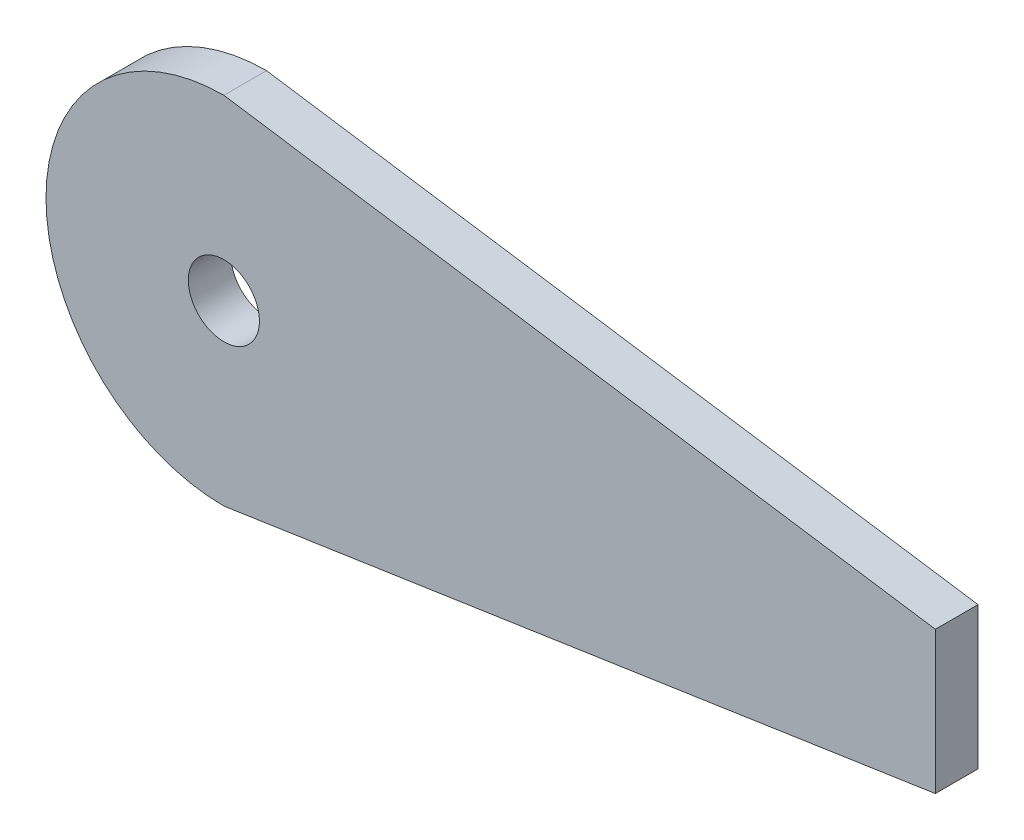
ISO-10303-21;
HEADER;
FILE_DESCRIPTION(('STEP AP214'),'2;1');
FILE_NAME('part.step','',(''),(''),'','','');
FILE_SCHEMA(('AUTOMOTIVE_DESIGN { 1 0 10303 214 1 1 1 1 }'));
ENDSEC;
DATA;
#1=APPLICATION_CONTEXT('core data for automotive mechanical design processes');
#2=APPLICATION_PROTOCOL_DEFINITION('international standard','automotive_design',2000,#1);
#3=PRODUCT_CONTEXT('',#1,'mechanical');
#4=PRODUCT('Part','Part','',(#3));
#5=PRODUCT_RELATED_PRODUCT_CATEGORY('part','',(#4));
#6=PRODUCT_DEFINITION_FORMATION('','',#4);
#7=PRODUCT_DEFINITION_CONTEXT('part definition',#1,'design');
#8=PRODUCT_DEFINITION('design','',#6,#7);
#9=PRODUCT_DEFINITION_SHAPE('','',#8);
#10=(LENGTH_UNIT() NAMED_UNIT(*) SI_UNIT(.MILLI.,.METRE.));
#11=(NAMED_UNIT(*) PLANE_ANGLE_UNIT() SI_UNIT($,.RADIAN.));
#12=(NAMED_UNIT(*) SI_UNIT($,.STERADIAN.) SOLID_ANGLE_UNIT());
#13=UNCERTAINTY_MEASURE_WITH_UNIT(LENGTH_MEASURE(1.E-05),#10,'distance_accuracy_value','');
#14=(GEOMETRIC_REPRESENTATION_CONTEXT(3) GLOBAL_UNCERTAINTY_ASSIGNED_CONTEXT((#13)) GLOBAL_UNIT_ASSIGNED_CONTEXT((#10,
#11,#12)) REPRESENTATION_CONTEXT('',''));
#15=CARTESIAN_POINT('',(0.,0.,0.));
#16=DIRECTION('',(0.,0.,1.));
#17=DIRECTION('',(1.,0.,0.));
#18=AXIS2_PLACEMENT_3D('',#15,#16,#17);
#19=CARTESIAN_POINT('',(0.,0.,3.));
#20=DIRECTION('',(0.,0.,1.));
#21=DIRECTION('',(1.,0.,0.));
#22=AXIS2_PLACEMENT_3D('',#19,#20,#21);
#23=PLANE('',#22);
#24=CARTESIAN_POINT('',(0.,0.,3.));
#25=DIRECTION('',(0.,0.,1.));
#26=DIRECTION('',(1.,0.,0.));
#27=AXIS2_PLACEMENT_3D('',#24,#25,#26);
#28=CIRCLE('',#27,12.5);
#29=CARTESIAN_POINT('',(0.,12.5,3.));
#30=VERTEX_POINT('',#29);
#31=CARTESIAN_POINT('',(0.,-12.5,3.));
#32=VERTEX_POINT('',#31);
#33=EDGE_CURVE('E88',#30,#32,#28,.T.);
#34=ORIENTED_EDGE('',*,*,#33,.T.);
#35=DIRECTION('',(0.988936352868298,0.148340452930245,0.));
#36=VECTOR('',#35,1.);
#37=CARTESIAN_POINT('',(50.,-5.,3.));
#38=LINE('',#37,#36);
#39=CARTESIAN_POINT('',(50.,-5.,3.));
#40=VERTEX_POINT('',#39);
#41=EDGE_CURVE('E83',#32,#40,#38,.T.);
#42=ORIENTED_EDGE('',*,*,#41,.T.);
#43=DIRECTION('',(0.,1.,0.));
#44=VECTOR('',#43,1.);
#45=CARTESIAN_POINT('',(50.,5.,3.));
#46=LINE('',#45,#44);
#47=CARTESIAN_POINT('',(50.,5.,3.));
#48=VERTEX_POINT('',#47);
#49=EDGE_CURVE('E86',#40,#48,#46,.T.);
#50=ORIENTED_EDGE('',*,*,#49,.T.);
#51=DIRECTION('',(-0.988936352868298,0.148340452930245,0.));
#52=VECTOR('',#51,1.);
#53=CARTESIAN_POINT('',(0.,12.5,3.));
#54=LINE('',#53,#52);
#55=EDGE_CURVE('E53',#48,#30,#54,.T.);
#56=ORIENTED_EDGE('',*,*,#55,.T.);
#57=EDGE_LOOP('',(#34,#42,#50,#56));
#58=FACE_BOUND('',#57,.T.);
#59=CARTESIAN_POINT('',(0.,0.,3.));
#60=DIRECTION('',(0.,0.,1.));
#61=DIRECTION('',(1.,0.,0.));
#62=AXIS2_PLACEMENT_3D('',#59,#60,#61);
#63=CIRCLE('',#62,2.5);
#64=CARTESIAN_POINT('',(2.5,0.,3.));
#65=VERTEX_POINT('',#64);
#66=EDGE_CURVE('E103',#65,#65,#63,.T.);
#67=ORIENTED_EDGE('',*,*,#66,.F.);
#68=EDGE_LOOP('',(#67));
#69=FACE_BOUND('',#68,.T.);
#70=ADVANCED_FACE('F36',(#58,#69),#23,.T.);
#71=CARTESIAN_POINT('',(0.,0.,0.));
#72=DIRECTION('',(0.,0.,1.));
#73=DIRECTION('',(1.,0.,0.));
#74=AXIS2_PLACEMENT_3D('',#71,#72,#73);
#75=PLANE('',#74);
#76=CARTESIAN_POINT('',(0.,0.,0.));
#77=DIRECTION('',(0.,0.,1.));
#78=DIRECTION('',(1.,0.,0.));
#79=AXIS2_PLACEMENT_3D('',#76,#77,#78);
#80=CIRCLE('',#79,12.5);
#81=CARTESIAN_POINT('',(0.,12.5,0.));
#82=VERTEX_POINT('',#81);
#83=CARTESIAN_POINT('',(0.,-12.5,0.));
#84=VERTEX_POINT('',#83);
#85=EDGE_CURVE('E100',#82,#84,#80,.T.);
#86=ORIENTED_EDGE('',*,*,#85,.F.);
#87=DIRECTION('',(-0.988936352868298,0.148340452930245,0.));
#88=VECTOR('',#87,1.);
#89=CARTESIAN_POINT('',(0.,12.5,0.));
#90=LINE('',#89,#88);
#91=CARTESIAN_POINT('',(50.,5.,0.));
#92=VERTEX_POINT('',#91);
#93=EDGE_CURVE('E76',#92,#82,#90,.T.);
#94=ORIENTED_EDGE('',*,*,#93,.F.);
#95=DIRECTION('',(0.,1.,0.));
#96=VECTOR('',#95,1.);
#97=CARTESIAN_POINT('',(50.,5.,0.));
#98=LINE('',#97,#96);
#99=CARTESIAN_POINT('',(50.,-5.,0.));
#100=VERTEX_POINT('',#99);
#101=EDGE_CURVE('E70',#100,#92,#98,.T.);
#102=ORIENTED_EDGE('',*,*,#101,.F.);
#103=DIRECTION('',(0.988936352868298,0.148340452930245,0.));
#104=VECTOR('',#103,1.);
#105=CARTESIAN_POINT('',(50.,-5.,0.));
#106=LINE('',#105,#104);
#107=EDGE_CURVE('E92',#84,#100,#106,.T.);
#108=ORIENTED_EDGE('',*,*,#107,.F.);
#109=EDGE_LOOP('',(#86,#94,#102,#108));
#110=FACE_BOUND('',#109,.T.);
#111=CARTESIAN_POINT('',(0.,0.,0.));
#112=DIRECTION('',(0.,0.,1.));
#113=DIRECTION('',(1.,0.,0.));
#114=AXIS2_PLACEMENT_3D('',#111,#112,#113);
#115=CIRCLE('',#114,2.5);
#116=CARTESIAN_POINT('',(2.5,0.,0.));
#117=VERTEX_POINT('',#116);
#118=EDGE_CURVE('E115',#117,#117,#115,.T.);
#119=ORIENTED_EDGE('',*,*,#118,.T.);
#120=EDGE_LOOP('',(#119));
#121=FACE_BOUND('',#120,.T.);
#122=ADVANCED_FACE('F111',(#110,#121),#75,.F.);
#123=CARTESIAN_POINT('',(0.,0.,3.));
#124=DIRECTION('',(0.,0.,-1.));
#125=DIRECTION('',(-1.,0.,0.));
#126=AXIS2_PLACEMENT_3D('',#123,#124,#125);
#127=CYLINDRICAL_SURFACE('',#126,12.5);
#128=ORIENTED_EDGE('',*,*,#85,.T.);
#129=DIRECTION('',(0.,0.,-1.));
#130=VECTOR('',#129,1.);
#131=CARTESIAN_POINT('',(0.,-12.5,3.));
#132=LINE('',#131,#130);
#133=EDGE_CURVE('E11',#32,#84,#132,.T.);
#134=ORIENTED_EDGE('',*,*,#133,.F.);
#135=ORIENTED_EDGE('',*,*,#33,.F.);
#136=DIRECTION('',(0.,0.,-1.));
#137=VECTOR('',#136,1.);
#138=CARTESIAN_POINT('',(0.,12.5,3.));
#139=LINE('',#138,#137);
#140=EDGE_CURVE('E96',#30,#82,#139,.T.);
#141=ORIENTED_EDGE('',*,*,#140,.T.);
#142=EDGE_LOOP('',(#128,#134,#135,#141));
#143=FACE_BOUND('',#142,.T.);
#144=ADVANCED_FACE('F38',(#143),#127,.T.);
#145=CARTESIAN_POINT('',(50.,-5.,3.));
#146=DIRECTION('',(-0.148340452930245,0.988936352868298,0.));
#147=DIRECTION('',(-0.988936352868298,-0.148340452930245,0.));
#148=AXIS2_PLACEMENT_3D('',#145,#146,#147);
#149=PLANE('',#148);
#150=ORIENTED_EDGE('',*,*,#107,.T.);
#151=DIRECTION('',(0.,0.,-1.));
#152=VECTOR('',#151,1.);
#153=CARTESIAN_POINT('',(50.,-5.,3.));
#154=LINE('',#153,#152);
#155=EDGE_CURVE('E45',#40,#100,#154,.T.);
#156=ORIENTED_EDGE('',*,*,#155,.F.);
#157=ORIENTED_EDGE('',*,*,#41,.F.);
#158=ORIENTED_EDGE('',*,*,#133,.T.);
#159=EDGE_LOOP('',(#150,#156,#157,#158));
#160=FACE_BOUND('',#159,.T.);
#161=ADVANCED_FACE('F91',(#160),#149,.F.);
#162=CARTESIAN_POINT('',(50.,5.,3.));
#163=DIRECTION('',(-1.,0.,0.));
#164=DIRECTION('',(0.,0.,1.));
#165=AXIS2_PLACEMENT_3D('',#162,#163,#164);
#166=PLANE('',#165);
#167=ORIENTED_EDGE('',*,*,#101,.T.);
#168=DIRECTION('',(0.,0.,-1.));
#169=VECTOR('',#168,1.);
#170=CARTESIAN_POINT('',(50.,5.,3.));
#171=LINE('',#170,#169);
#172=EDGE_CURVE('E93',#48,#92,#171,.T.);
#173=ORIENTED_EDGE('',*,*,#172,.F.);
#174=ORIENTED_EDGE('',*,*,#49,.F.);
#175=ORIENTED_EDGE('',*,*,#155,.T.);
#176=EDGE_LOOP('',(#167,#173,#174,#175));
#177=FACE_BOUND('',#176,.T.);
#178=ADVANCED_FACE('F94',(#177),#166,.F.);
#179=CARTESIAN_POINT('',(0.,12.5,3.));
#180=DIRECTION('',(-0.148340452930245,-0.988936352868298,0.));
#181=DIRECTION('',(0.988936352868298,-0.148340452930245,0.));
#182=AXIS2_PLACEMENT_3D('',#179,#180,#181);
#183=PLANE('',#182);
#184=ORIENTED_EDGE('',*,*,#93,.T.);
#185=ORIENTED_EDGE('',*,*,#140,.F.);
#186=ORIENTED_EDGE('',*,*,#55,.F.);
#187=ORIENTED_EDGE('',*,*,#172,.T.);
#188=EDGE_LOOP('',(#184,#185,#186,#187));
#189=FACE_BOUND('',#188,.T.);
#190=ADVANCED_FACE('F108',(#189),#183,.F.);
#191=CARTESIAN_POINT('',(0.,0.,3.));
#192=DIRECTION('',(0.,0.,-1.));
#193=DIRECTION('',(-1.,0.,0.));
#194=AXIS2_PLACEMENT_3D('',#191,#192,#193);
#195=CYLINDRICAL_SURFACE('',#194,2.5);
#196=ORIENTED_EDGE('',*,*,#66,.T.);
#197=EDGE_LOOP('',(#196));
#198=FACE_BOUND('',#197,.T.);
#199=ORIENTED_EDGE('',*,*,#118,.F.);
#200=EDGE_LOOP('',(#199));
#201=FACE_BOUND('',#200,.T.);
#202=ADVANCED_FACE('F121',(#198,#201),#195,.F.);
#203=CLOSED_SHELL('',(#70,#122,#144,#161,#178,#190,#202));
#204=MANIFOLD_SOLID_BREP('B2',#203);
#205=ADVANCED_BREP_SHAPE_REPRESENTATION('',(#18,#204),#14);
#206=SHAPE_DEFINITION_REPRESENTATION(#9,#205);
ENDSEC;
END-ISO-10303-21;
